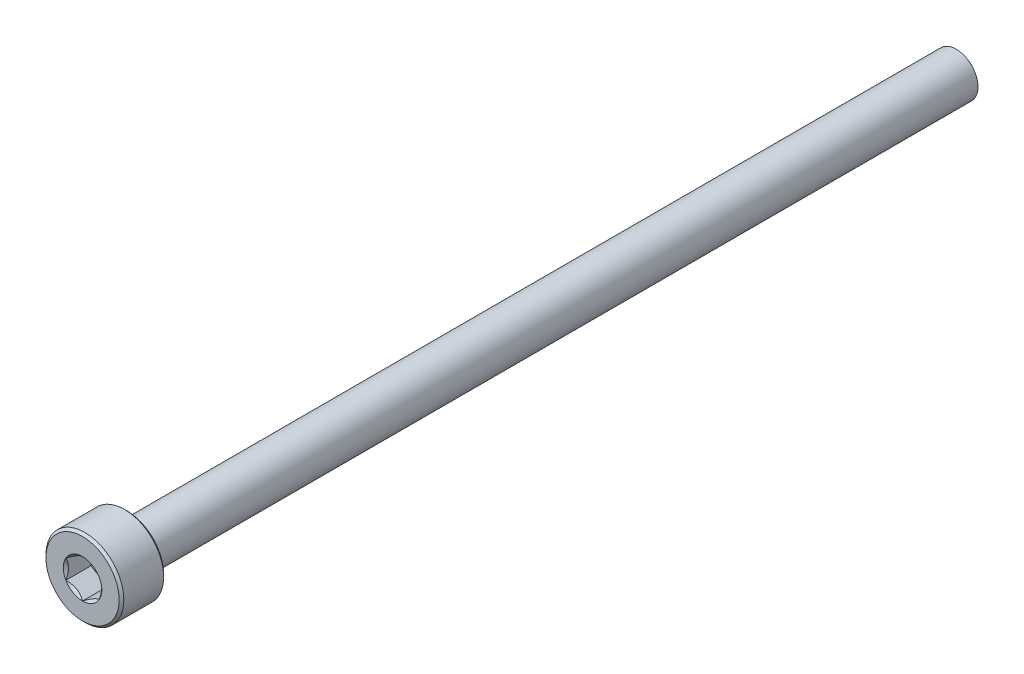
ISO-10303-21;
HEADER;
FILE_DESCRIPTION(('STEP AP214'),'2;1');
FILE_NAME('part.step','',(''),(''),'','','');
FILE_SCHEMA(('AUTOMOTIVE_DESIGN { 1 0 10303 214 1 1 1 1 }'));
ENDSEC;
DATA;
#1=APPLICATION_CONTEXT('core data for automotive mechanical design processes');
#2=APPLICATION_PROTOCOL_DEFINITION('international standard','automotive_design',2000,#1);
#3=PRODUCT_CONTEXT('',#1,'mechanical');
#4=PRODUCT('Part','Part','',(#3));
#5=PRODUCT_RELATED_PRODUCT_CATEGORY('part','',(#4));
#6=PRODUCT_DEFINITION_FORMATION('','',#4);
#7=PRODUCT_DEFINITION_CONTEXT('part definition',#1,'design');
#8=PRODUCT_DEFINITION('design','',#6,#7);
#9=PRODUCT_DEFINITION_SHAPE('','',#8);
#10=(LENGTH_UNIT() NAMED_UNIT(*) SI_UNIT(.MILLI.,.METRE.));
#11=(NAMED_UNIT(*) PLANE_ANGLE_UNIT() SI_UNIT($,.RADIAN.));
#12=(NAMED_UNIT(*) SI_UNIT($,.STERADIAN.) SOLID_ANGLE_UNIT());
#13=UNCERTAINTY_MEASURE_WITH_UNIT(LENGTH_MEASURE(1.E-05),#10,'distance_accuracy_value','');
#14=(GEOMETRIC_REPRESENTATION_CONTEXT(3) GLOBAL_UNCERTAINTY_ASSIGNED_CONTEXT((#13)) GLOBAL_UNIT_ASSIGNED_CONTEXT((#10,
#11,#12)) REPRESENTATION_CONTEXT('',''));
#15=CARTESIAN_POINT('',(0.,0.,0.));
#16=DIRECTION('',(0.,0.,1.));
#17=DIRECTION('',(1.,0.,0.));
#18=AXIS2_PLACEMENT_3D('',#15,#16,#17);
#19=CARTESIAN_POINT('',(1.5,0.866025403784442,1.75));
#20=DIRECTION('',(0.5,0.866025403784439,0.));
#21=DIRECTION('',(0.,0.,-1.));
#22=AXIS2_PLACEMENT_3D('',#19,#20,#21);
#23=PLANE('',#22);
#24=DIRECTION('',(0.,0.,1.));
#25=VECTOR('',#24,1.);
#26=CARTESIAN_POINT('',(1.5,0.866025403784442,1.75));
#27=LINE('',#26,#25);
#28=CARTESIAN_POINT('',(1.5,0.866025403784442,1.75));
#29=VERTEX_POINT('',#28);
#30=CARTESIAN_POINT('',(1.5,0.866025403784451,4.));
#31=VERTEX_POINT('',#30);
#32=EDGE_CURVE('E11',#29,#31,#27,.T.);
#33=ORIENTED_EDGE('',*,*,#32,.T.);
#34=CARTESIAN_POINT('',(1.50000000000001,0.866025403784438,4.));
#35=CARTESIAN_POINT('',(0.750000000000006,1.29903810567666,3.56698729810778));
#36=CARTESIAN_POINT('',(0.,1.73205080756888,4.));
#37=(BOUNDED_CURVE() B_SPLINE_CURVE(2,(#34,#35,#36),.UNSPECIFIED.,.F.,
.F.) B_SPLINE_CURVE_WITH_KNOTS((3,3),(-0.388312804292311,-0.130611113351455),
.UNSPECIFIED.) CURVE() GEOMETRIC_REPRESENTATION_ITEM() RATIONAL_B_SPLINE_CURVE((1.30940107675851,
1.51196612828743,1.30940107675851)) REPRESENTATION_ITEM(''));
#38=CARTESIAN_POINT('',(0.,1.73205080756888,4.));
#39=VERTEX_POINT('',#38);
#40=EDGE_CURVE('E178',#31,#39,#37,.T.);
#41=ORIENTED_EDGE('',*,*,#40,.T.);
#42=DIRECTION('',(0.,0.,1.));
#43=VECTOR('',#42,1.);
#44=CARTESIAN_POINT('',(0.,1.73205080756888,1.75));
#45=LINE('',#44,#43);
#46=CARTESIAN_POINT('',(0.,1.73205080756888,1.75));
#47=VERTEX_POINT('',#46);
#48=EDGE_CURVE('E112',#47,#39,#45,.T.);
#49=ORIENTED_EDGE('',*,*,#48,.F.);
#50=DIRECTION('',(-0.866025403784439,0.5,0.));
#51=VECTOR('',#50,1.);
#52=CARTESIAN_POINT('',(1.5,0.866025403784442,1.75));
#53=LINE('',#52,#51);
#54=EDGE_CURVE('E182',#29,#47,#53,.T.);
#55=ORIENTED_EDGE('',*,*,#54,.F.);
#56=EDGE_LOOP('',(#33,#41,#49,#55));
#57=FACE_BOUND('',#56,.T.);
#58=ADVANCED_FACE('F17',(#57),#23,.F.);
#59=CARTESIAN_POINT('',(1.5,-0.866025403784445,1.75));
#60=DIRECTION('',(1.,0.,0.));
#61=DIRECTION('',(0.,0.,-1.));
#62=AXIS2_PLACEMENT_3D('',#59,#60,#61);
#63=PLANE('',#62);
#64=DIRECTION('',(0.,0.,1.));
#65=VECTOR('',#64,1.);
#66=CARTESIAN_POINT('',(1.5,-0.866025403784445,1.75));
#67=LINE('',#66,#65);
#68=CARTESIAN_POINT('',(1.5,-0.866025403784445,1.75));
#69=VERTEX_POINT('',#68);
#70=CARTESIAN_POINT('',(1.5,-0.866025403784445,4.));
#71=VERTEX_POINT('',#70);
#72=EDGE_CURVE('E30',#69,#71,#67,.T.);
#73=ORIENTED_EDGE('',*,*,#72,.T.);
#74=CARTESIAN_POINT('',(1.5,-0.866025403784462,4.00000000000001));
#75=CARTESIAN_POINT('',(1.5,0.,3.56698729810777));
#76=CARTESIAN_POINT('',(1.5,0.866025403784445,4.));
#77=(BOUNDED_CURVE() B_SPLINE_CURVE(2,(#74,#75,#76),.UNSPECIFIED.,.F.,
.F.) B_SPLINE_CURVE_WITH_KNOTS((3,3),(-0.388312804292318,-0.130611113351458),
.UNSPECIFIED.) CURVE() GEOMETRIC_REPRESENTATION_ITEM() RATIONAL_B_SPLINE_CURVE((1.30940107675851,
1.51196612828743,1.30940107675851)) REPRESENTATION_ITEM(''));
#78=EDGE_CURVE('E259',#71,#31,#77,.T.);
#79=ORIENTED_EDGE('',*,*,#78,.T.);
#80=ORIENTED_EDGE('',*,*,#32,.F.);
#81=DIRECTION('',(0.,1.,0.));
#82=VECTOR('',#81,1.);
#83=CARTESIAN_POINT('',(1.5,-0.866025403784445,1.75));
#84=LINE('',#83,#82);
#85=EDGE_CURVE('E172',#69,#29,#84,.T.);
#86=ORIENTED_EDGE('',*,*,#85,.F.);
#87=EDGE_LOOP('',(#73,#79,#80,#86));
#88=FACE_BOUND('',#87,.T.);
#89=ADVANCED_FACE('F402',(#88),#63,.F.);
#90=CARTESIAN_POINT('',(0.,-1.73205080756888,1.75));
#91=DIRECTION('',(0.5,-0.866025403784439,0.));
#92=DIRECTION('',(0.,0.,-1.));
#93=AXIS2_PLACEMENT_3D('',#90,#91,#92);
#94=PLANE('',#93);
#95=DIRECTION('',(0.,0.,1.));
#96=VECTOR('',#95,1.);
#97=CARTESIAN_POINT('',(0.,-1.73205080756888,1.75));
#98=LINE('',#97,#96);
#99=CARTESIAN_POINT('',(0.,-1.73205080756888,1.75));
#100=VERTEX_POINT('',#99);
#101=CARTESIAN_POINT('',(0.,-1.73205080756888,4.));
#102=VERTEX_POINT('',#101);
#103=EDGE_CURVE('E255',#100,#102,#98,.T.);
#104=ORIENTED_EDGE('',*,*,#103,.T.);
#105=CARTESIAN_POINT('',(0.,-1.73205080756888,4.00000000000001));
#106=CARTESIAN_POINT('',(0.750000000000007,-1.29903810567666,3.56698729810779));
#107=CARTESIAN_POINT('',(1.5,-0.866025403784444,4.));
#108=(BOUNDED_CURVE() B_SPLINE_CURVE(2,(#105,#106,#107),.UNSPECIFIED.,.F.,
.F.) B_SPLINE_CURVE_WITH_KNOTS((3,3),(-0.38831280429231,-0.130611113351458),
.UNSPECIFIED.) CURVE() GEOMETRIC_REPRESENTATION_ITEM() RATIONAL_B_SPLINE_CURVE((1.30940107675849,
1.5119661282874,1.3094010767585)) REPRESENTATION_ITEM(''));
#109=EDGE_CURVE('E183',#102,#71,#108,.T.);
#110=ORIENTED_EDGE('',*,*,#109,.T.);
#111=ORIENTED_EDGE('',*,*,#72,.F.);
#112=DIRECTION('',(0.866025403784439,0.5,0.));
#113=VECTOR('',#112,1.);
#114=CARTESIAN_POINT('',(0.,-1.73205080756888,1.75));
#115=LINE('',#114,#113);
#116=EDGE_CURVE('E168',#100,#69,#115,.T.);
#117=ORIENTED_EDGE('',*,*,#116,.F.);
#118=EDGE_LOOP('',(#104,#110,#111,#117));
#119=FACE_BOUND('',#118,.T.);
#120=ADVANCED_FACE('F389',(#119),#94,.F.);
#121=CARTESIAN_POINT('',(-1.5,-0.86602540378444,1.75));
#122=DIRECTION('',(-0.5,-0.866025403784439,0.));
#123=DIRECTION('',(-0.866025403784439,0.5,0.));
#124=AXIS2_PLACEMENT_3D('',#121,#122,#123);
#125=PLANE('',#124);
#126=DIRECTION('',(0.,0.,1.));
#127=VECTOR('',#126,1.);
#128=CARTESIAN_POINT('',(-1.5,-0.86602540378444,1.75));
#129=LINE('',#128,#127);
#130=CARTESIAN_POINT('',(-1.5,-0.86602540378444,1.75));
#131=VERTEX_POINT('',#130);
#132=CARTESIAN_POINT('',(-1.5,-0.866025403784445,4.));
#133=VERTEX_POINT('',#132);
#134=EDGE_CURVE('E252',#131,#133,#129,.T.);
#135=ORIENTED_EDGE('',*,*,#134,.T.);
#136=CARTESIAN_POINT('',(-1.49999999999996,-0.866025403784457,3.99999999999998));
#137=CARTESIAN_POINT('',(-0.749999999999977,-1.29903810567667,3.56698729810778));
#138=CARTESIAN_POINT('',(0.,-1.73205080756888,4.));
#139=(BOUNDED_CURVE() B_SPLINE_CURVE(2,(#136,#137,#138),.UNSPECIFIED.,.F.,
.F.) B_SPLINE_CURVE_WITH_KNOTS((3,3),(-0.388312804292307,-0.130611113351455),
.UNSPECIFIED.) CURVE() GEOMETRIC_REPRESENTATION_ITEM() RATIONAL_B_SPLINE_CURVE((1.30940107675852,
1.51196612828742,1.30940107675851)) REPRESENTATION_ITEM(''));
#140=EDGE_CURVE('E194',#133,#102,#139,.T.);
#141=ORIENTED_EDGE('',*,*,#140,.T.);
#142=ORIENTED_EDGE('',*,*,#103,.F.);
#143=DIRECTION('',(0.866025403784439,-0.5,0.));
#144=VECTOR('',#143,1.);
#145=CARTESIAN_POINT('',(-1.5,-0.86602540378444,1.75));
#146=LINE('',#145,#144);
#147=EDGE_CURVE('E173',#131,#100,#146,.T.);
#148=ORIENTED_EDGE('',*,*,#147,.F.);
#149=EDGE_LOOP('',(#135,#141,#142,#148));
#150=FACE_BOUND('',#149,.T.);
#151=ADVANCED_FACE('F395',(#150),#125,.F.);
#152=CARTESIAN_POINT('',(-1.5,0.866025403784442,1.75));
#153=DIRECTION('',(-1.,0.,0.));
#154=DIRECTION('',(0.,1.,0.));
#155=AXIS2_PLACEMENT_3D('',#152,#153,#154);
#156=PLANE('',#155);
#157=DIRECTION('',(0.,0.,1.));
#158=VECTOR('',#157,1.);
#159=CARTESIAN_POINT('',(-1.5,0.866025403784442,1.75));
#160=LINE('',#159,#158);
#161=CARTESIAN_POINT('',(-1.5,0.866025403784442,1.75));
#162=VERTEX_POINT('',#161);
#163=CARTESIAN_POINT('',(-1.5,0.86602540378444,4.));
#164=VERTEX_POINT('',#163);
#165=EDGE_CURVE('E99',#162,#164,#160,.T.);
#166=ORIENTED_EDGE('',*,*,#165,.T.);
#167=CARTESIAN_POINT('',(-1.49999999999999,0.866025403784433,4.));
#168=CARTESIAN_POINT('',(-1.49999999999999,0.,3.56698729810778));
#169=CARTESIAN_POINT('',(-1.49999999999999,-0.866025403784447,4.));
#170=(BOUNDED_CURVE() B_SPLINE_CURVE(2,(#167,#168,#169),.UNSPECIFIED.,.F.,
.F.) B_SPLINE_CURVE_WITH_KNOTS((3,3),(-0.388312804292311,-0.130611113351455),
.UNSPECIFIED.) CURVE() GEOMETRIC_REPRESENTATION_ITEM() RATIONAL_B_SPLINE_CURVE((1.30940107675851,
1.51196612828743,1.30940107675851)) REPRESENTATION_ITEM(''));
#171=EDGE_CURVE('E188',#164,#133,#170,.T.);
#172=ORIENTED_EDGE('',*,*,#171,.T.);
#173=ORIENTED_EDGE('',*,*,#134,.F.);
#174=DIRECTION('',(0.,-1.,0.));
#175=VECTOR('',#174,1.);
#176=CARTESIAN_POINT('',(-1.5,0.866025403784442,1.75));
#177=LINE('',#176,#175);
#178=EDGE_CURVE('E162',#162,#131,#177,.T.);
#179=ORIENTED_EDGE('',*,*,#178,.F.);
#180=EDGE_LOOP('',(#166,#172,#173,#179));
#181=FACE_BOUND('',#180,.T.);
#182=ADVANCED_FACE('F405',(#181),#156,.F.);
#183=CARTESIAN_POINT('',(0.,1.73205080756888,1.75));
#184=DIRECTION('',(-0.5,0.866025403784439,0.));
#185=DIRECTION('',(0.,0.,1.));
#186=AXIS2_PLACEMENT_3D('',#183,#184,#185);
#187=PLANE('',#186);
#188=ORIENTED_EDGE('',*,*,#48,.T.);
#189=CARTESIAN_POINT('',(0.,1.73205080756889,4.00000000000001));
#190=CARTESIAN_POINT('',(-0.749999999999987,1.29903810567666,3.56698729810779));
#191=CARTESIAN_POINT('',(-1.49999999999999,0.866025403784441,4.));
#192=(BOUNDED_CURVE() B_SPLINE_CURVE(2,(#189,#190,#191),.UNSPECIFIED.,.F.,
.F.) B_SPLINE_CURVE_WITH_KNOTS((3,3),(-0.388312804292311,-0.130611113351458),
.UNSPECIFIED.) CURVE() GEOMETRIC_REPRESENTATION_ITEM() RATIONAL_B_SPLINE_CURVE((1.30940107675849,
1.5119661282874,1.3094010767585)) REPRESENTATION_ITEM(''));
#193=EDGE_CURVE('E21',#39,#164,#192,.T.);
#194=ORIENTED_EDGE('',*,*,#193,.T.);
#195=ORIENTED_EDGE('',*,*,#165,.F.);
#196=DIRECTION('',(-0.866025403784439,-0.5,0.));
#197=VECTOR('',#196,1.);
#198=CARTESIAN_POINT('',(0.,1.73205080756888,1.75));
#199=LINE('',#198,#197);
#200=EDGE_CURVE('E237',#47,#162,#199,.T.);
#201=ORIENTED_EDGE('',*,*,#200,.F.);
#202=EDGE_LOOP('',(#188,#194,#195,#201));
#203=FACE_BOUND('',#202,.T.);
#204=ADVANCED_FACE('F271',(#203),#187,.F.);
#205=CARTESIAN_POINT('',(3.,0.,1.75));
#206=DIRECTION('',(0.,0.,-1.));
#207=DIRECTION('',(-1.,0.,0.));
#208=AXIS2_PLACEMENT_3D('',#205,#206,#207);
#209=PLANE('',#208);
#210=ORIENTED_EDGE('',*,*,#54,.T.);
#211=ORIENTED_EDGE('',*,*,#200,.T.);
#212=ORIENTED_EDGE('',*,*,#178,.T.);
#213=ORIENTED_EDGE('',*,*,#147,.T.);
#214=ORIENTED_EDGE('',*,*,#116,.T.);
#215=ORIENTED_EDGE('',*,*,#85,.T.);
#216=EDGE_LOOP('',(#210,#211,#212,#213,#214,#215));
#217=FACE_BOUND('',#216,.T.);
#218=ADVANCED_FACE('F403',(#217),#209,.F.);
#219=CARTESIAN_POINT('',(0.,0.,4.));
#220=DIRECTION('',(0.,0.,1.));
#221=DIRECTION('',(1.,0.,0.));
#222=AXIS2_PLACEMENT_3D('',#219,#220,#221);
#223=CONICAL_SURFACE('',#222,1.73205080756888,0.78539816339745);
#224=CARTESIAN_POINT('',(0.,0.,4.));
#225=DIRECTION('',(0.,0.,1.));
#226=DIRECTION('',(1.,0.,0.));
#227=AXIS2_PLACEMENT_3D('',#224,#225,#226);
#228=CIRCLE('',#227,1.73205080756888);
#229=EDGE_CURVE('E176',#31,#39,#228,.T.);
#230=ORIENTED_EDGE('',*,*,#229,.T.);
#231=ORIENTED_EDGE('',*,*,#40,.F.);
#232=EDGE_LOOP('',(#230,#231));
#233=FACE_BOUND('',#232,.T.);
#234=ADVANCED_FACE('F283',(#233),#223,.F.);
#235=CARTESIAN_POINT('',(0.,0.,4.));
#236=DIRECTION('',(0.,0.,1.));
#237=DIRECTION('',(1.,0.,0.));
#238=AXIS2_PLACEMENT_3D('',#235,#236,#237);
#239=CONICAL_SURFACE('',#238,1.73205080756888,0.78539816339745);
#240=CARTESIAN_POINT('',(0.,0.,4.));
#241=DIRECTION('',(0.,0.,1.));
#242=DIRECTION('',(1.,0.,0.));
#243=AXIS2_PLACEMENT_3D('',#240,#241,#242);
#244=CIRCLE('',#243,1.73205080756888);
#245=EDGE_CURVE('E203',#102,#71,#244,.T.);
#246=ORIENTED_EDGE('',*,*,#245,.T.);
#247=ORIENTED_EDGE('',*,*,#109,.F.);
#248=EDGE_LOOP('',(#246,#247));
#249=FACE_BOUND('',#248,.T.);
#250=ADVANCED_FACE('F19',(#249),#239,.F.);
#251=CARTESIAN_POINT('',(0.,0.,4.));
#252=DIRECTION('',(0.,0.,1.));
#253=DIRECTION('',(1.,0.,0.));
#254=AXIS2_PLACEMENT_3D('',#251,#252,#253);
#255=CONICAL_SURFACE('',#254,1.73205080756888,0.78539816339745);
#256=CARTESIAN_POINT('',(0.,0.,4.));
#257=DIRECTION('',(0.,0.,1.));
#258=DIRECTION('',(1.,0.,0.));
#259=AXIS2_PLACEMENT_3D('',#256,#257,#258);
#260=CIRCLE('',#259,1.73205080756888);
#261=EDGE_CURVE('E195',#133,#102,#260,.T.);
#262=ORIENTED_EDGE('',*,*,#261,.T.);
#263=ORIENTED_EDGE('',*,*,#140,.F.);
#264=EDGE_LOOP('',(#262,#263));
#265=FACE_BOUND('',#264,.T.);
#266=ADVANCED_FACE('F397',(#265),#255,.F.);
#267=CARTESIAN_POINT('',(0.,0.,4.));
#268=DIRECTION('',(0.,0.,1.));
#269=DIRECTION('',(-1.,0.,0.));
#270=AXIS2_PLACEMENT_3D('',#267,#268,#269);
#271=CONICAL_SURFACE('',#270,1.73205080756888,0.78539816339745);
#272=CARTESIAN_POINT('',(0.,0.,4.));
#273=DIRECTION('',(0.,0.,1.));
#274=DIRECTION('',(1.,0.,0.));
#275=AXIS2_PLACEMENT_3D('',#272,#273,#274);
#276=CIRCLE('',#275,1.73205080756888);
#277=EDGE_CURVE('E202',#164,#133,#276,.T.);
#278=ORIENTED_EDGE('',*,*,#277,.T.);
#279=ORIENTED_EDGE('',*,*,#171,.F.);
#280=EDGE_LOOP('',(#278,#279));
#281=FACE_BOUND('',#280,.T.);
#282=ADVANCED_FACE('F408',(#281),#271,.F.);
#283=CARTESIAN_POINT('',(0.,0.,4.));
#284=DIRECTION('',(0.,0.,1.));
#285=DIRECTION('',(1.,0.,0.));
#286=AXIS2_PLACEMENT_3D('',#283,#284,#285);
#287=CONICAL_SURFACE('',#286,1.73205080756888,0.78539816339745);
#288=CARTESIAN_POINT('',(0.,0.,4.));
#289=DIRECTION('',(0.,0.,1.));
#290=DIRECTION('',(1.,0.,0.));
#291=AXIS2_PLACEMENT_3D('',#288,#289,#290);
#292=CIRCLE('',#291,1.73205080756888);
#293=EDGE_CURVE('E225',#39,#164,#292,.T.);
#294=ORIENTED_EDGE('',*,*,#293,.T.);
#295=ORIENTED_EDGE('',*,*,#193,.F.);
#296=EDGE_LOOP('',(#294,#295));
#297=FACE_BOUND('',#296,.T.);
#298=ADVANCED_FACE('F272',(#297),#287,.F.);
#299=CARTESIAN_POINT('',(0.,0.,0.));
#300=DIRECTION('',(0.,0.,1.));
#301=DIRECTION('',(1.,0.,0.));
#302=AXIS2_PLACEMENT_3D('',#299,#300,#301);
#303=PLANE('',#302);
#304=CARTESIAN_POINT('',(0.,0.,0.));
#305=DIRECTION('',(0.,0.,-1.));
#306=DIRECTION('',(-1.,0.,0.));
#307=AXIS2_PLACEMENT_3D('',#304,#305,#306);
#308=CIRCLE('',#307,1.954);
#309=CARTESIAN_POINT('',(1.954,0.,0.));
#310=VERTEX_POINT('',#309);
#311=EDGE_CURVE('E87',#310,#310,#308,.T.);
#312=ORIENTED_EDGE('',*,*,#311,.F.);
#313=EDGE_LOOP('',(#312));
#314=FACE_BOUND('',#313,.T.);
#315=CARTESIAN_POINT('',(0.,0.,0.));
#316=DIRECTION('',(0.,0.,-1.));
#317=DIRECTION('',(1.,0.,0.));
#318=AXIS2_PLACEMENT_3D('',#315,#316,#317);
#319=CIRCLE('',#318,3.29);
#320=CARTESIAN_POINT('',(-3.29,0.,0.));
#321=VERTEX_POINT('',#320);
#322=EDGE_CURVE('E215',#321,#321,#319,.T.);
#323=ORIENTED_EDGE('',*,*,#322,.T.);
#324=EDGE_LOOP('',(#323));
#325=FACE_BOUND('',#324,.T.);
#326=ADVANCED_FACE('F415',(#314,#325),#303,.F.);
#327=CARTESIAN_POINT('',(0.,0.,4.));
#328=DIRECTION('',(0.,0.,1.));
#329=DIRECTION('',(1.,0.,0.));
#330=AXIS2_PLACEMENT_3D('',#327,#328,#329);
#331=PLANE('',#330);
#332=ORIENTED_EDGE('',*,*,#229,.F.);
#333=CARTESIAN_POINT('',(0.,0.,4.));
#334=DIRECTION('',(0.,0.,1.));
#335=DIRECTION('',(1.,0.,0.));
#336=AXIS2_PLACEMENT_3D('',#333,#334,#335);
#337=CIRCLE('',#336,1.73205080756888);
#338=EDGE_CURVE('E177',#71,#31,#337,.T.);
#339=ORIENTED_EDGE('',*,*,#338,.F.);
#340=ORIENTED_EDGE('',*,*,#245,.F.);
#341=ORIENTED_EDGE('',*,*,#261,.F.);
#342=ORIENTED_EDGE('',*,*,#277,.F.);
#343=ORIENTED_EDGE('',*,*,#293,.F.);
#344=EDGE_LOOP('',(#332,#339,#340,#341,#342,#343));
#345=FACE_BOUND('',#344,.T.);
#346=CARTESIAN_POINT('',(0.,0.,4.));
#347=DIRECTION('',(0.,0.,1.));
#348=DIRECTION('',(1.,0.,0.));
#349=AXIS2_PLACEMENT_3D('',#346,#347,#348);
#350=CIRCLE('',#349,3.29);
#351=CARTESIAN_POINT('',(3.29,0.,4.));
#352=VERTEX_POINT('',#351);
#353=EDGE_CURVE('E208',#352,#352,#350,.T.);
#354=ORIENTED_EDGE('',*,*,#353,.T.);
#355=EDGE_LOOP('',(#354));
#356=FACE_BOUND('',#355,.T.);
#357=ADVANCED_FACE('F276',(#345,#356),#331,.T.);
#358=CARTESIAN_POINT('',(0.,0.,-75.));
#359=DIRECTION('',(0.,0.,-1.));
#360=DIRECTION('',(-1.,0.,0.));
#361=AXIS2_PLACEMENT_3D('',#358,#359,#360);
#362=PLANE('',#361);
#363=CARTESIAN_POINT('',(0.,0.,-75.));
#364=DIRECTION('',(0.,0.,-1.));
#365=DIRECTION('',(-1.,0.,0.));
#366=AXIS2_PLACEMENT_3D('',#363,#364,#365);
#367=CIRCLE('',#366,1.3);
#368=CARTESIAN_POINT('',(1.3,0.,-75.));
#369=VERTEX_POINT('',#368);
#370=EDGE_CURVE('E144',#369,#369,#367,.T.);
#371=ORIENTED_EDGE('',*,*,#370,.T.);
#372=EDGE_LOOP('',(#371));
#373=FACE_BOUND('',#372,.T.);
#374=ADVANCED_FACE('F446',(#373),#362,.T.);
#375=CARTESIAN_POINT('',(0.,0.,4.));
#376=DIRECTION('',(0.,0.,-1.));
#377=DIRECTION('',(-1.,0.,0.));
#378=AXIS2_PLACEMENT_3D('',#375,#376,#377);
#379=CYLINDRICAL_SURFACE('',#378,3.5);
#380=CARTESIAN_POINT('',(0.,0.,0.210000000000008));
#381=DIRECTION('',(0.,0.,1.));
#382=DIRECTION('',(1.,0.,0.));
#383=AXIS2_PLACEMENT_3D('',#380,#381,#382);
#384=CIRCLE('',#383,3.5);
#385=CARTESIAN_POINT('',(3.5,0.,0.210000000000008));
#386=VERTEX_POINT('',#385);
#387=CARTESIAN_POINT('',(-3.5,0.,0.210000000000008));
#388=VERTEX_POINT('',#387);
#389=EDGE_CURVE('E164',#386,#388,#384,.T.);
#390=ORIENTED_EDGE('',*,*,#389,.T.);
#391=CARTESIAN_POINT('',(0.,0.,0.210000000000008));
#392=DIRECTION('',(0.,0.,1.));
#393=DIRECTION('',(1.,0.,0.));
#394=AXIS2_PLACEMENT_3D('',#391,#392,#393);
#395=CIRCLE('',#394,3.5);
#396=EDGE_CURVE('E167',#388,#386,#395,.T.);
#397=ORIENTED_EDGE('',*,*,#396,.T.);
#398=DIRECTION('',(0.,0.,1.));
#399=VECTOR('',#398,1.);
#400=CARTESIAN_POINT('',(3.5,0.,4.));
#401=LINE('',#400,#399);
#402=CARTESIAN_POINT('',(3.5,0.,3.79));
#403=VERTEX_POINT('',#402);
#404=EDGE_CURVE('E71',#386,#403,#401,.T.);
#405=ORIENTED_EDGE('',*,*,#404,.T.);
#406=CARTESIAN_POINT('',(0.,0.,3.79));
#407=DIRECTION('',(0.,0.,-1.));
#408=DIRECTION('',(1.,0.,0.));
#409=AXIS2_PLACEMENT_3D('',#406,#407,#408);
#410=CIRCLE('',#409,3.5);
#411=EDGE_CURVE('E209',#403,#403,#410,.T.);
#412=ORIENTED_EDGE('',*,*,#411,.T.);
#413=ORIENTED_EDGE('',*,*,#404,.F.);
#414=EDGE_LOOP('',(#390,#397,#405,#412,#413));
#415=FACE_BOUND('',#414,.T.);
#416=ADVANCED_FACE('F443',(#415),#379,.T.);
#417=CARTESIAN_POINT('',(0.,0.,4.));
#418=DIRECTION('',(0.,0.,1.));
#419=DIRECTION('',(1.,0.,0.));
#420=AXIS2_PLACEMENT_3D('',#417,#418,#419);
#421=CONICAL_SURFACE('',#420,1.73205080756888,0.78539816339745);
#422=ORIENTED_EDGE('',*,*,#78,.F.);
#423=ORIENTED_EDGE('',*,*,#338,.T.);
#424=EDGE_LOOP('',(#422,#423));
#425=FACE_BOUND('',#424,.T.);
#426=ADVANCED_FACE('F400',(#425),#421,.F.);
#427=CARTESIAN_POINT('',(0.,0.,4.));
#428=DIRECTION('',(0.,0.,-1.));
#429=DIRECTION('',(-1.,0.,0.));
#430=AXIS2_PLACEMENT_3D('',#427,#428,#429);
#431=CONICAL_SURFACE('',#430,3.29,0.785398163397457);
#432=ORIENTED_EDGE('',*,*,#411,.F.);
#433=DIRECTION('',(-0.707106781186554,0.,0.707106781186541));
#434=VECTOR('',#433,1.);
#435=CARTESIAN_POINT('',(3.29,0.,4.));
#436=LINE('',#435,#434);
#437=EDGE_CURVE('E204',#403,#352,#436,.T.);
#438=ORIENTED_EDGE('',*,*,#437,.T.);
#439=ORIENTED_EDGE('',*,*,#353,.F.);
#440=ORIENTED_EDGE('',*,*,#437,.F.);
#441=EDGE_LOOP('',(#432,#438,#439,#440));
#442=FACE_BOUND('',#441,.T.);
#443=ADVANCED_FACE('F432',(#442),#431,.T.);
#444=CARTESIAN_POINT('',(0.,0.,0.210000000000008));
#445=DIRECTION('',(0.,0.,1.));
#446=DIRECTION('',(1.,0.,0.));
#447=AXIS2_PLACEMENT_3D('',#444,#445,#446);
#448=CONICAL_SURFACE('',#447,3.5,0.785398163397407);
#449=ORIENTED_EDGE('',*,*,#389,.F.);
#450=ORIENTED_EDGE('',*,*,#396,.F.);
#451=DIRECTION('',(0.707106781186518,0.,-0.707106781186577));
#452=VECTOR('',#451,1.);
#453=CARTESIAN_POINT('',(-3.5,0.,0.210000000000008));
#454=LINE('',#453,#452);
#455=EDGE_CURVE('E218',#388,#321,#454,.T.);
#456=ORIENTED_EDGE('',*,*,#455,.T.);
#457=ORIENTED_EDGE('',*,*,#322,.F.);
#458=ORIENTED_EDGE('',*,*,#455,.F.);
#459=EDGE_LOOP('',(#449,#450,#456,#457,#458));
#460=FACE_BOUND('',#459,.T.);
#461=ADVANCED_FACE('F435',(#460),#448,.T.);
#462=CARTESIAN_POINT('',(0.,0.,0.));
#463=DIRECTION('',(0.,0.,-1.));
#464=DIRECTION('',(-1.,0.,0.));
#465=AXIS2_PLACEMENT_3D('',#462,#463,#464);
#466=CYLINDRICAL_SURFACE('',#465,1.954);
#467=CARTESIAN_POINT('',(0.,0.,-74.5328571428571));
#468=DIRECTION('',(0.,0.,1.));
#469=DIRECTION('',(-1.,0.,0.));
#470=AXIS2_PLACEMENT_3D('',#467,#468,#469);
#471=CIRCLE('',#470,1.954);
#472=CARTESIAN_POINT('',(1.954,0.,-74.5328571428571));
#473=VERTEX_POINT('',#472);
#474=EDGE_CURVE('E142',#473,#473,#471,.T.);
#475=ORIENTED_EDGE('',*,*,#474,.T.);
#476=DIRECTION('',(0.,0.,1.));
#477=VECTOR('',#476,1.);
#478=CARTESIAN_POINT('',(1.954,0.,0.));
#479=LINE('',#478,#477);
#480=EDGE_CURVE('E138',#473,#310,#479,.T.);
#481=ORIENTED_EDGE('',*,*,#480,.T.);
#482=ORIENTED_EDGE('',*,*,#311,.T.);
#483=ORIENTED_EDGE('',*,*,#480,.F.);
#484=EDGE_LOOP('',(#475,#481,#482,#483));
#485=FACE_BOUND('',#484,.T.);
#486=ADVANCED_FACE('F140',(#485),#466,.T.);
#487=CARTESIAN_POINT('',(0.,0.,-74.75));
#488=DIRECTION('',(0.,0.,1.));
#489=DIRECTION('',(-1.,0.,0.));
#490=AXIS2_PLACEMENT_3D('',#487,#488,#489);
#491=CONICAL_SURFACE('',#490,1.65,0.950546840812083);
#492=ORIENTED_EDGE('',*,*,#474,.F.);
#493=DIRECTION('',(-0.813733471206739,0.,-0.58123819371909));
#494=VECTOR('',#493,1.);
#495=CARTESIAN_POINT('',(1.65,0.,-74.75));
#496=LINE('',#495,#494);
#497=EDGE_CURVE('E149',#473,#369,#496,.T.);
#498=ORIENTED_EDGE('',*,*,#497,.T.);
#499=ORIENTED_EDGE('',*,*,#370,.F.);
#500=ORIENTED_EDGE('',*,*,#497,.F.);
#501=EDGE_LOOP('',(#492,#498,#499,#500));
#502=FACE_BOUND('',#501,.T.);
#503=ADVANCED_FACE('F150',(#502),#491,.T.);
#504=CLOSED_SHELL('',(#58,#89,#120,#151,#182,#204,#218,#234,#250,#266,#282,#298,#326,#357,#374,
#416,#426,#443,#461,#486,#503));
#505=MANIFOLD_SOLID_BREP('B1',#504);
#506=ADVANCED_BREP_SHAPE_REPRESENTATION('',(#18,#505),#14);
#507=SHAPE_DEFINITION_REPRESENTATION(#9,#506);
ENDSEC;
END-ISO-10303-21;
